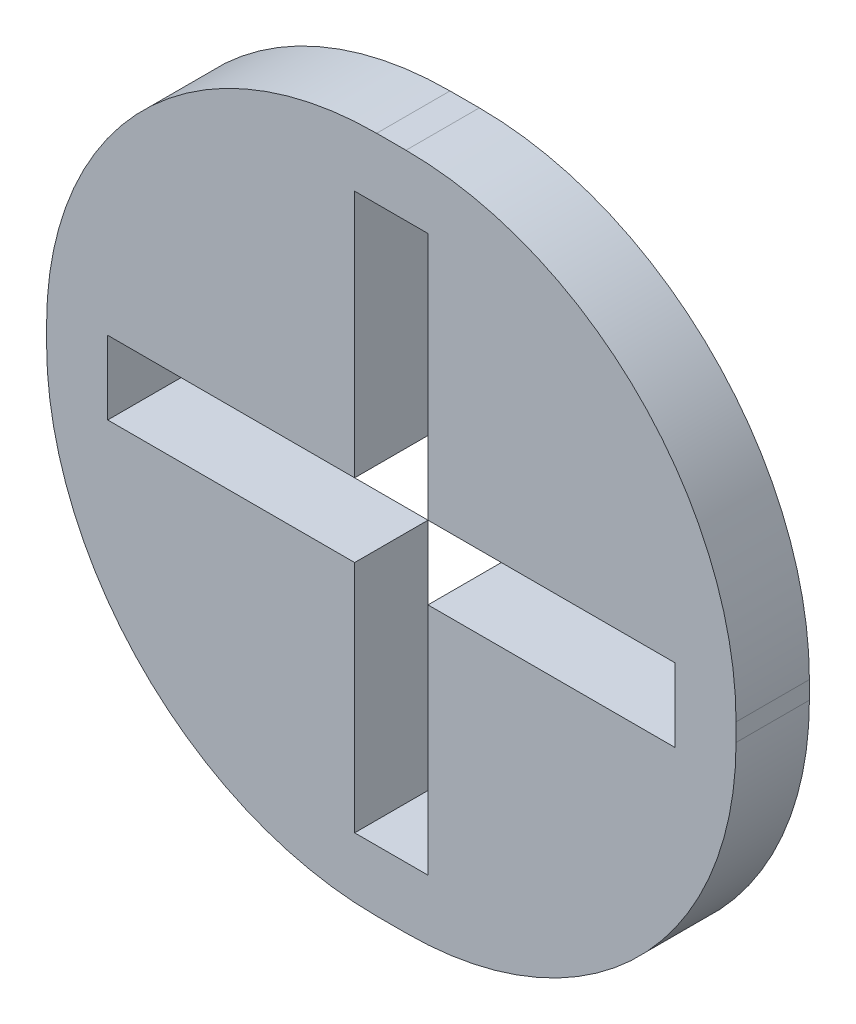
ISO-10303-21;
HEADER;
FILE_DESCRIPTION(('STEP AP214'),'2;1');
FILE_NAME('part.step','',(''),(''),'','','');
FILE_SCHEMA(('AUTOMOTIVE_DESIGN { 1 0 10303 214 1 1 1 1 }'));
ENDSEC;
DATA;
#1=APPLICATION_CONTEXT('core data for automotive mechanical design processes');
#2=APPLICATION_PROTOCOL_DEFINITION('international standard','automotive_design',2000,#1);
#3=PRODUCT_CONTEXT('',#1,'mechanical');
#4=PRODUCT('Part','Part','',(#3));
#5=PRODUCT_RELATED_PRODUCT_CATEGORY('part','',(#4));
#6=PRODUCT_DEFINITION_FORMATION('','',#4);
#7=PRODUCT_DEFINITION_CONTEXT('part definition',#1,'design');
#8=PRODUCT_DEFINITION('design','',#6,#7);
#9=PRODUCT_DEFINITION_SHAPE('','',#8);
#10=(LENGTH_UNIT() NAMED_UNIT(*) SI_UNIT(.MILLI.,.METRE.));
#11=(NAMED_UNIT(*) PLANE_ANGLE_UNIT() SI_UNIT($,.RADIAN.));
#12=(NAMED_UNIT(*) SI_UNIT($,.STERADIAN.) SOLID_ANGLE_UNIT());
#13=UNCERTAINTY_MEASURE_WITH_UNIT(LENGTH_MEASURE(1.E-05),#10,'distance_accuracy_value','');
#14=(GEOMETRIC_REPRESENTATION_CONTEXT(3) GLOBAL_UNCERTAINTY_ASSIGNED_CONTEXT((#13)) GLOBAL_UNIT_ASSIGNED_CONTEXT((#10,
#11,#12)) REPRESENTATION_CONTEXT('',''));
#15=CARTESIAN_POINT('',(0.,0.,0.));
#16=DIRECTION('',(0.,0.,1.));
#17=DIRECTION('',(1.,0.,0.));
#18=AXIS2_PLACEMENT_3D('',#15,#16,#17);
#19=CARTESIAN_POINT('',(0.,13.865,3.));
#20=DIRECTION('',(0.,-1.,0.));
#21=DIRECTION('',(0.,0.,-1.));
#22=AXIS2_PLACEMENT_3D('',#19,#20,#21);
#23=PLANE('',#22);
#24=DIRECTION('',(-1.,0.,0.));
#25=VECTOR('',#24,1.);
#26=CARTESIAN_POINT('',(0.,13.865,0.));
#27=LINE('',#26,#25);
#28=CARTESIAN_POINT('',(0.599999999999993,13.865,0.));
#29=VERTEX_POINT('',#28);
#30=CARTESIAN_POINT('',(-0.60000000000001,13.865,0.));
#31=VERTEX_POINT('',#30);
#32=EDGE_CURVE('E254',#29,#31,#27,.T.);
#33=ORIENTED_EDGE('',*,*,#32,.T.);
#34=DIRECTION('',(0.,0.,-1.));
#35=VECTOR('',#34,1.);
#36=CARTESIAN_POINT('',(-0.60000000000001,13.865,3.));
#37=LINE('',#36,#35);
#38=CARTESIAN_POINT('',(-0.60000000000001,13.865,3.));
#39=VERTEX_POINT('',#38);
#40=EDGE_CURVE('E11',#39,#31,#37,.T.);
#41=ORIENTED_EDGE('',*,*,#40,.F.);
#42=DIRECTION('',(-1.,0.,0.));
#43=VECTOR('',#42,1.);
#44=CARTESIAN_POINT('',(0.,13.865,3.));
#45=LINE('',#44,#43);
#46=CARTESIAN_POINT('',(0.599999999999993,13.865,3.));
#47=VERTEX_POINT('',#46);
#48=EDGE_CURVE('E405',#47,#39,#45,.T.);
#49=ORIENTED_EDGE('',*,*,#48,.F.);
#50=DIRECTION('',(0.,0.,-1.));
#51=VECTOR('',#50,1.);
#52=CARTESIAN_POINT('',(0.599999999999993,13.865,3.));
#53=LINE('',#52,#51);
#54=EDGE_CURVE('E281',#47,#29,#53,.T.);
#55=ORIENTED_EDGE('',*,*,#54,.T.);
#56=EDGE_LOOP('',(#33,#41,#49,#55));
#57=FACE_BOUND('',#56,.T.);
#58=ADVANCED_FACE('F45',(#57),#23,.F.);
#59=CARTESIAN_POINT('',(-0.600000000000008,0.365000000000019,3.));
#60=DIRECTION('',(0.,0.,-1.));
#61=DIRECTION('',(-1.,0.,0.));
#62=AXIS2_PLACEMENT_3D('',#59,#60,#61);
#63=CYLINDRICAL_SURFACE('',#62,13.5);
#64=CARTESIAN_POINT('',(-0.600000000000008,0.365000000000019,0.));
#65=DIRECTION('',(0.,0.,1.));
#66=DIRECTION('',(1.,0.,0.));
#67=AXIS2_PLACEMENT_3D('',#64,#65,#66);
#68=CIRCLE('',#67,13.5);
#69=CARTESIAN_POINT('',(-14.1,0.365000000000011,0.));
#70=VERTEX_POINT('',#69);
#71=EDGE_CURVE('E258',#31,#70,#68,.T.);
#72=ORIENTED_EDGE('',*,*,#71,.T.);
#73=DIRECTION('',(0.,0.,-1.));
#74=VECTOR('',#73,1.);
#75=CARTESIAN_POINT('',(-14.1,0.365000000000011,3.));
#76=LINE('',#75,#74);
#77=CARTESIAN_POINT('',(-14.1,0.365000000000011,3.));
#78=VERTEX_POINT('',#77);
#79=EDGE_CURVE('E56',#78,#70,#76,.T.);
#80=ORIENTED_EDGE('',*,*,#79,.F.);
#81=CARTESIAN_POINT('',(-0.600000000000008,0.365000000000019,3.));
#82=DIRECTION('',(0.,0.,1.));
#83=DIRECTION('',(1.,0.,0.));
#84=AXIS2_PLACEMENT_3D('',#81,#82,#83);
#85=CIRCLE('',#84,13.5);
#86=EDGE_CURVE('E408',#39,#78,#85,.T.);
#87=ORIENTED_EDGE('',*,*,#86,.F.);
#88=ORIENTED_EDGE('',*,*,#40,.T.);
#89=EDGE_LOOP('',(#72,#80,#87,#88));
#90=FACE_BOUND('',#89,.T.);
#91=ADVANCED_FACE('F440',(#90),#63,.T.);
#92=CARTESIAN_POINT('',(-14.1,-1.00518908265503E-13,3.));
#93=DIRECTION('',(-1.,0.,0.));
#94=DIRECTION('',(0.,-1.,0.));
#95=AXIS2_PLACEMENT_3D('',#92,#93,#94);
#96=PLANE('',#95);
#97=DIRECTION('',(0.,1.,0.));
#98=VECTOR('',#97,1.);
#99=CARTESIAN_POINT('',(-14.1,-1.00518908265503E-13,0.));
#100=LINE('',#99,#98);
#101=CARTESIAN_POINT('',(-14.1,-0.365000000000006,0.));
#102=VERTEX_POINT('',#101);
#103=EDGE_CURVE('E262',#102,#70,#100,.T.);
#104=ORIENTED_EDGE('',*,*,#103,.F.);
#105=DIRECTION('',(0.,0.,-1.));
#106=VECTOR('',#105,1.);
#107=CARTESIAN_POINT('',(-14.1,-0.365000000000006,3.));
#108=LINE('',#107,#106);
#109=CARTESIAN_POINT('',(-14.1,-0.365000000000006,3.));
#110=VERTEX_POINT('',#109);
#111=EDGE_CURVE('E291',#110,#102,#108,.T.);
#112=ORIENTED_EDGE('',*,*,#111,.F.);
#113=DIRECTION('',(0.,1.,0.));
#114=VECTOR('',#113,1.);
#115=CARTESIAN_POINT('',(-14.1,-1.00518908265503E-13,3.));
#116=LINE('',#115,#114);
#117=EDGE_CURVE('E411',#110,#78,#116,.T.);
#118=ORIENTED_EDGE('',*,*,#117,.T.);
#119=ORIENTED_EDGE('',*,*,#79,.T.);
#120=EDGE_LOOP('',(#104,#112,#118,#119));
#121=FACE_BOUND('',#120,.T.);
#122=ADVANCED_FACE('F445',(#121),#96,.T.);
#123=CARTESIAN_POINT('',(-0.600000000000008,-0.364999999999998,3.));
#124=DIRECTION('',(0.,0.,-1.));
#125=DIRECTION('',(-1.,0.,0.));
#126=AXIS2_PLACEMENT_3D('',#123,#124,#125);
#127=CYLINDRICAL_SURFACE('',#126,13.5);
#128=CARTESIAN_POINT('',(-0.600000000000008,-0.364999999999998,0.));
#129=DIRECTION('',(0.,0.,1.));
#130=DIRECTION('',(1.,0.,0.));
#131=AXIS2_PLACEMENT_3D('',#128,#129,#130);
#132=CIRCLE('',#131,13.5);
#133=CARTESIAN_POINT('',(-0.600000000000006,-13.865,0.));
#134=VERTEX_POINT('',#133);
#135=EDGE_CURVE('E266',#134,#102,#132,.F.);
#136=ORIENTED_EDGE('',*,*,#135,.F.);
#137=DIRECTION('',(0.,0.,-1.));
#138=VECTOR('',#137,1.);
#139=CARTESIAN_POINT('',(-0.600000000000006,-13.865,3.));
#140=LINE('',#139,#138);
#141=CARTESIAN_POINT('',(-0.600000000000006,-13.865,3.));
#142=VERTEX_POINT('',#141);
#143=EDGE_CURVE('E288',#142,#134,#140,.T.);
#144=ORIENTED_EDGE('',*,*,#143,.F.);
#145=CARTESIAN_POINT('',(-0.600000000000008,-0.364999999999998,3.));
#146=DIRECTION('',(0.,0.,1.));
#147=DIRECTION('',(1.,0.,0.));
#148=AXIS2_PLACEMENT_3D('',#145,#146,#147);
#149=CIRCLE('',#148,13.5);
#150=EDGE_CURVE('E415',#142,#110,#149,.F.);
#151=ORIENTED_EDGE('',*,*,#150,.T.);
#152=ORIENTED_EDGE('',*,*,#111,.T.);
#153=EDGE_LOOP('',(#136,#144,#151,#152));
#154=FACE_BOUND('',#153,.T.);
#155=ADVANCED_FACE('F608',(#154),#127,.T.);
#156=CARTESIAN_POINT('',(0.,-13.865,3.));
#157=DIRECTION('',(0.,-1.,0.));
#158=DIRECTION('',(0.,0.,-1.));
#159=AXIS2_PLACEMENT_3D('',#156,#157,#158);
#160=PLANE('',#159);
#161=DIRECTION('',(-1.,0.,0.));
#162=VECTOR('',#161,1.);
#163=CARTESIAN_POINT('',(0.,-13.865,0.));
#164=LINE('',#163,#162);
#165=CARTESIAN_POINT('',(0.600000000000006,-13.865,0.));
#166=VERTEX_POINT('',#165);
#167=EDGE_CURVE('E270',#166,#134,#164,.T.);
#168=ORIENTED_EDGE('',*,*,#167,.F.);
#169=DIRECTION('',(0.,0.,-1.));
#170=VECTOR('',#169,1.);
#171=CARTESIAN_POINT('',(0.600000000000006,-13.865,3.));
#172=LINE('',#171,#170);
#173=CARTESIAN_POINT('',(0.600000000000006,-13.865,3.));
#174=VERTEX_POINT('',#173);
#175=EDGE_CURVE('E212',#174,#166,#172,.T.);
#176=ORIENTED_EDGE('',*,*,#175,.F.);
#177=DIRECTION('',(-1.,0.,0.));
#178=VECTOR('',#177,1.);
#179=CARTESIAN_POINT('',(0.,-13.865,3.));
#180=LINE('',#179,#178);
#181=EDGE_CURVE('E203',#174,#142,#180,.T.);
#182=ORIENTED_EDGE('',*,*,#181,.T.);
#183=ORIENTED_EDGE('',*,*,#143,.T.);
#184=EDGE_LOOP('',(#168,#176,#182,#183));
#185=FACE_BOUND('',#184,.T.);
#186=ADVANCED_FACE('F421',(#185),#160,.T.);
#187=CARTESIAN_POINT('',(0.6,-0.364999999999997,3.));
#188=DIRECTION('',(0.,0.,-1.));
#189=DIRECTION('',(-1.,0.,0.));
#190=AXIS2_PLACEMENT_3D('',#187,#188,#189);
#191=CYLINDRICAL_SURFACE('',#190,13.5);
#192=CARTESIAN_POINT('',(0.6,-0.364999999999997,0.));
#193=DIRECTION('',(0.,0.,1.));
#194=DIRECTION('',(1.,0.,0.));
#195=AXIS2_PLACEMENT_3D('',#192,#193,#194);
#196=CIRCLE('',#195,13.5);
#197=CARTESIAN_POINT('',(14.1,-0.364999999999997,0.));
#198=VERTEX_POINT('',#197);
#199=EDGE_CURVE('E210',#166,#198,#196,.T.);
#200=ORIENTED_EDGE('',*,*,#199,.T.);
#201=DIRECTION('',(0.,0.,-1.));
#202=VECTOR('',#201,1.);
#203=CARTESIAN_POINT('',(14.1,-0.364999999999997,3.));
#204=LINE('',#203,#202);
#205=CARTESIAN_POINT('',(14.1,-0.364999999999997,3.));
#206=VERTEX_POINT('',#205);
#207=EDGE_CURVE('E207',#206,#198,#204,.T.);
#208=ORIENTED_EDGE('',*,*,#207,.F.);
#209=CARTESIAN_POINT('',(0.6,-0.364999999999997,3.));
#210=DIRECTION('',(0.,0.,1.));
#211=DIRECTION('',(1.,0.,0.));
#212=AXIS2_PLACEMENT_3D('',#209,#210,#211);
#213=CIRCLE('',#212,13.5);
#214=EDGE_CURVE('E196',#174,#206,#213,.T.);
#215=ORIENTED_EDGE('',*,*,#214,.F.);
#216=ORIENTED_EDGE('',*,*,#175,.T.);
#217=EDGE_LOOP('',(#200,#208,#215,#216));
#218=FACE_BOUND('',#217,.T.);
#219=ADVANCED_FACE('F208',(#218),#191,.T.);
#220=CARTESIAN_POINT('',(14.1,0.,3.));
#221=DIRECTION('',(-1.,0.,0.));
#222=DIRECTION('',(0.,-1.,0.));
#223=AXIS2_PLACEMENT_3D('',#220,#221,#222);
#224=PLANE('',#223);
#225=DIRECTION('',(0.,1.,0.));
#226=VECTOR('',#225,1.);
#227=CARTESIAN_POINT('',(14.1,0.,0.));
#228=LINE('',#227,#226);
#229=CARTESIAN_POINT('',(14.1,0.36500000000002,0.));
#230=VERTEX_POINT('',#229);
#231=EDGE_CURVE('E130',#198,#230,#228,.T.);
#232=ORIENTED_EDGE('',*,*,#231,.T.);
#233=DIRECTION('',(0.,0.,-1.));
#234=VECTOR('',#233,1.);
#235=CARTESIAN_POINT('',(14.1,0.36500000000002,3.));
#236=LINE('',#235,#234);
#237=CARTESIAN_POINT('',(14.1,0.36500000000002,3.));
#238=VERTEX_POINT('',#237);
#239=EDGE_CURVE('E213',#238,#230,#236,.T.);
#240=ORIENTED_EDGE('',*,*,#239,.F.);
#241=DIRECTION('',(0.,1.,0.));
#242=VECTOR('',#241,1.);
#243=CARTESIAN_POINT('',(14.1,0.,3.));
#244=LINE('',#243,#242);
#245=EDGE_CURVE('E200',#206,#238,#244,.T.);
#246=ORIENTED_EDGE('',*,*,#245,.F.);
#247=ORIENTED_EDGE('',*,*,#207,.T.);
#248=EDGE_LOOP('',(#232,#240,#246,#247));
#249=FACE_BOUND('',#248,.T.);
#250=ADVANCED_FACE('F215',(#249),#224,.F.);
#251=CARTESIAN_POINT('',(0.,11.365,3.));
#252=DIRECTION('',(0.,1.,0.));
#253=DIRECTION('',(0.,0.,1.));
#254=AXIS2_PLACEMENT_3D('',#251,#252,#253);
#255=PLANE('',#254);
#256=DIRECTION('',(1.,0.,0.));
#257=VECTOR('',#256,1.);
#258=CARTESIAN_POINT('',(0.,11.365,0.));
#259=LINE('',#258,#257);
#260=CARTESIAN_POINT('',(-1.5,11.365,0.));
#261=VERTEX_POINT('',#260);
#262=CARTESIAN_POINT('',(1.5,11.365,0.));
#263=VERTEX_POINT('',#262);
#264=EDGE_CURVE('E223',#261,#263,#259,.T.);
#265=ORIENTED_EDGE('',*,*,#264,.T.);
#266=DIRECTION('',(0.,0.,-1.));
#267=VECTOR('',#266,1.);
#268=CARTESIAN_POINT('',(1.5,11.365,3.));
#269=LINE('',#268,#267);
#270=CARTESIAN_POINT('',(1.5,11.365,3.));
#271=VERTEX_POINT('',#270);
#272=EDGE_CURVE('E49',#271,#263,#269,.T.);
#273=ORIENTED_EDGE('',*,*,#272,.F.);
#274=DIRECTION('',(1.,0.,0.));
#275=VECTOR('',#274,1.);
#276=CARTESIAN_POINT('',(0.,11.365,3.));
#277=LINE('',#276,#275);
#278=CARTESIAN_POINT('',(-1.5,11.365,3.));
#279=VERTEX_POINT('',#278);
#280=EDGE_CURVE('E280',#279,#271,#277,.T.);
#281=ORIENTED_EDGE('',*,*,#280,.F.);
#282=DIRECTION('',(0.,0.,-1.));
#283=VECTOR('',#282,1.);
#284=CARTESIAN_POINT('',(-1.5,11.365,3.));
#285=LINE('',#284,#283);
#286=EDGE_CURVE('E219',#279,#261,#285,.T.);
#287=ORIENTED_EDGE('',*,*,#286,.T.);
#288=EDGE_LOOP('',(#265,#273,#281,#287));
#289=FACE_BOUND('',#288,.T.);
#290=ADVANCED_FACE('F47',(#289),#255,.F.);
#291=CARTESIAN_POINT('',(1.5,0.,3.));
#292=DIRECTION('',(1.,0.,0.));
#293=DIRECTION('',(0.,0.,-1.));
#294=AXIS2_PLACEMENT_3D('',#291,#292,#293);
#295=PLANE('',#294);
#296=DIRECTION('',(0.,-1.,0.));
#297=VECTOR('',#296,1.);
#298=CARTESIAN_POINT('',(1.5,0.,0.));
#299=LINE('',#298,#297);
#300=CARTESIAN_POINT('',(1.5,1.21,0.));
#301=VERTEX_POINT('',#300);
#302=EDGE_CURVE('E227',#263,#301,#299,.T.);
#303=ORIENTED_EDGE('',*,*,#302,.T.);
#304=DIRECTION('',(0.,0.,-1.));
#305=VECTOR('',#304,1.);
#306=CARTESIAN_POINT('',(1.5,1.21,3.));
#307=LINE('',#306,#305);
#308=CARTESIAN_POINT('',(1.5,1.21,3.));
#309=VERTEX_POINT('',#308);
#310=EDGE_CURVE('E329',#309,#301,#307,.T.);
#311=ORIENTED_EDGE('',*,*,#310,.F.);
#312=DIRECTION('',(0.,-1.,0.));
#313=VECTOR('',#312,1.);
#314=CARTESIAN_POINT('',(1.5,0.,3.));
#315=LINE('',#314,#313);
#316=EDGE_CURVE('E145',#271,#309,#315,.T.);
#317=ORIENTED_EDGE('',*,*,#316,.F.);
#318=ORIENTED_EDGE('',*,*,#272,.T.);
#319=EDGE_LOOP('',(#303,#311,#317,#318));
#320=FACE_BOUND('',#319,.T.);
#321=ADVANCED_FACE('F337',(#320),#295,.F.);
#322=CARTESIAN_POINT('',(0.,1.21,3.));
#323=DIRECTION('',(0.,1.,0.));
#324=DIRECTION('',(0.,0.,1.));
#325=AXIS2_PLACEMENT_3D('',#322,#323,#324);
#326=PLANE('',#325);
#327=DIRECTION('',(1.,0.,0.));
#328=VECTOR('',#327,1.);
#329=CARTESIAN_POINT('',(0.,1.21,0.));
#330=LINE('',#329,#328);
#331=CARTESIAN_POINT('',(11.6,1.21,0.));
#332=VERTEX_POINT('',#331);
#333=EDGE_CURVE('E230',#301,#332,#330,.T.);
#334=ORIENTED_EDGE('',*,*,#333,.T.);
#335=DIRECTION('',(0.,0.,-1.));
#336=VECTOR('',#335,1.);
#337=CARTESIAN_POINT('',(11.6,1.21,3.));
#338=LINE('',#337,#336);
#339=CARTESIAN_POINT('',(11.6,1.21,3.));
#340=VERTEX_POINT('',#339);
#341=EDGE_CURVE('E326',#340,#332,#338,.T.);
#342=ORIENTED_EDGE('',*,*,#341,.F.);
#343=DIRECTION('',(1.,0.,0.));
#344=VECTOR('',#343,1.);
#345=CARTESIAN_POINT('',(0.,1.21,3.));
#346=LINE('',#345,#344);
#347=EDGE_CURVE('E477',#309,#340,#346,.T.);
#348=ORIENTED_EDGE('',*,*,#347,.F.);
#349=ORIENTED_EDGE('',*,*,#310,.T.);
#350=EDGE_LOOP('',(#334,#342,#348,#349));
#351=FACE_BOUND('',#350,.T.);
#352=ADVANCED_FACE('F452',(#351),#326,.F.);
#353=CARTESIAN_POINT('',(11.6,0.,3.));
#354=DIRECTION('',(1.,0.,0.));
#355=DIRECTION('',(0.,0.,-1.));
#356=AXIS2_PLACEMENT_3D('',#353,#354,#355);
#357=PLANE('',#356);
#358=DIRECTION('',(0.,-1.,0.));
#359=VECTOR('',#358,1.);
#360=CARTESIAN_POINT('',(11.6,0.,0.));
#361=LINE('',#360,#359);
#362=CARTESIAN_POINT('',(11.6,-1.79,0.));
#363=VERTEX_POINT('',#362);
#364=EDGE_CURVE('E234',#332,#363,#361,.T.);
#365=ORIENTED_EDGE('',*,*,#364,.T.);
#366=DIRECTION('',(0.,0.,-1.));
#367=VECTOR('',#366,1.);
#368=CARTESIAN_POINT('',(11.6,-1.79,3.));
#369=LINE('',#368,#367);
#370=CARTESIAN_POINT('',(11.6,-1.79,3.));
#371=VERTEX_POINT('',#370);
#372=EDGE_CURVE('E322',#371,#363,#369,.T.);
#373=ORIENTED_EDGE('',*,*,#372,.F.);
#374=DIRECTION('',(0.,-1.,0.));
#375=VECTOR('',#374,1.);
#376=CARTESIAN_POINT('',(11.6,0.,3.));
#377=LINE('',#376,#375);
#378=EDGE_CURVE('E475',#340,#371,#377,.T.);
#379=ORIENTED_EDGE('',*,*,#378,.F.);
#380=ORIENTED_EDGE('',*,*,#341,.T.);
#381=EDGE_LOOP('',(#365,#373,#379,#380));
#382=FACE_BOUND('',#381,.T.);
#383=ADVANCED_FACE('F461',(#382),#357,.F.);
#384=CARTESIAN_POINT('',(0.,-1.79,3.));
#385=DIRECTION('',(0.,-1.,0.));
#386=DIRECTION('',(0.,0.,-1.));
#387=AXIS2_PLACEMENT_3D('',#384,#385,#386);
#388=PLANE('',#387);
#389=DIRECTION('',(-1.,0.,0.));
#390=VECTOR('',#389,1.);
#391=CARTESIAN_POINT('',(0.,-1.79,0.));
#392=LINE('',#391,#390);
#393=CARTESIAN_POINT('',(1.5,-1.79,0.));
#394=VERTEX_POINT('',#393);
#395=EDGE_CURVE('E238',#363,#394,#392,.T.);
#396=ORIENTED_EDGE('',*,*,#395,.T.);
#397=DIRECTION('',(0.,0.,-1.));
#398=VECTOR('',#397,1.);
#399=CARTESIAN_POINT('',(1.5,-1.79,3.));
#400=LINE('',#399,#398);
#401=CARTESIAN_POINT('',(1.5,-1.79,3.));
#402=VERTEX_POINT('',#401);
#403=EDGE_CURVE('E318',#402,#394,#400,.T.);
#404=ORIENTED_EDGE('',*,*,#403,.F.);
#405=DIRECTION('',(-1.,0.,0.));
#406=VECTOR('',#405,1.);
#407=CARTESIAN_POINT('',(0.,-1.79,3.));
#408=LINE('',#407,#406);
#409=EDGE_CURVE('E397',#371,#402,#408,.T.);
#410=ORIENTED_EDGE('',*,*,#409,.F.);
#411=ORIENTED_EDGE('',*,*,#372,.T.);
#412=EDGE_LOOP('',(#396,#404,#410,#411));
#413=FACE_BOUND('',#412,.T.);
#414=ADVANCED_FACE('F457',(#413),#388,.F.);
#415=CARTESIAN_POINT('',(1.5,-11.365,0.));
#416=VERTEX_POINT('',#415);
#417=EDGE_CURVE('E231',#394,#416,#299,.T.);
#418=ORIENTED_EDGE('',*,*,#417,.T.);
#419=DIRECTION('',(0.,0.,-1.));
#420=VECTOR('',#419,1.);
#421=CARTESIAN_POINT('',(1.5,-11.365,3.));
#422=LINE('',#421,#420);
#423=CARTESIAN_POINT('',(1.5,-11.365,3.));
#424=VERTEX_POINT('',#423);
#425=EDGE_CURVE('E315',#424,#416,#422,.T.);
#426=ORIENTED_EDGE('',*,*,#425,.F.);
#427=EDGE_CURVE('E391',#402,#424,#315,.T.);
#428=ORIENTED_EDGE('',*,*,#427,.F.);
#429=ORIENTED_EDGE('',*,*,#403,.T.);
#430=EDGE_LOOP('',(#418,#426,#428,#429));
#431=FACE_BOUND('',#430,.T.);
#432=ADVANCED_FACE('F377',(#431),#295,.F.);
#433=CARTESIAN_POINT('',(0.,-11.365,3.));
#434=DIRECTION('',(0.,1.,0.));
#435=DIRECTION('',(0.,0.,1.));
#436=AXIS2_PLACEMENT_3D('',#433,#434,#435);
#437=PLANE('',#436);
#438=DIRECTION('',(1.,0.,0.));
#439=VECTOR('',#438,1.);
#440=CARTESIAN_POINT('',(0.,-11.365,0.));
#441=LINE('',#440,#439);
#442=CARTESIAN_POINT('',(-1.5,-11.365,0.));
#443=VERTEX_POINT('',#442);
#444=EDGE_CURVE('E242',#443,#416,#441,.T.);
#445=ORIENTED_EDGE('',*,*,#444,.F.);
#446=DIRECTION('',(0.,0.,-1.));
#447=VECTOR('',#446,1.);
#448=CARTESIAN_POINT('',(-1.5,-11.365,3.));
#449=LINE('',#448,#447);
#450=CARTESIAN_POINT('',(-1.5,-11.365,3.));
#451=VERTEX_POINT('',#450);
#452=EDGE_CURVE('E312',#451,#443,#449,.T.);
#453=ORIENTED_EDGE('',*,*,#452,.F.);
#454=DIRECTION('',(1.,0.,0.));
#455=VECTOR('',#454,1.);
#456=CARTESIAN_POINT('',(0.,-11.365,3.));
#457=LINE('',#456,#455);
#458=EDGE_CURVE('E386',#451,#424,#457,.T.);
#459=ORIENTED_EDGE('',*,*,#458,.T.);
#460=ORIENTED_EDGE('',*,*,#425,.T.);
#461=EDGE_LOOP('',(#445,#453,#459,#460));
#462=FACE_BOUND('',#461,.T.);
#463=ADVANCED_FACE('F384',(#462),#437,.T.);
#464=CARTESIAN_POINT('',(-1.5,0.,3.));
#465=DIRECTION('',(1.,0.,0.));
#466=DIRECTION('',(0.,0.,-1.));
#467=AXIS2_PLACEMENT_3D('',#464,#465,#466);
#468=PLANE('',#467);
#469=DIRECTION('',(0.,-1.,0.));
#470=VECTOR('',#469,1.);
#471=CARTESIAN_POINT('',(-1.5,0.,0.));
#472=LINE('',#471,#470);
#473=CARTESIAN_POINT('',(-1.5,-1.79,0.));
#474=VERTEX_POINT('',#473);
#475=EDGE_CURVE('E246',#474,#443,#472,.T.);
#476=ORIENTED_EDGE('',*,*,#475,.F.);
#477=DIRECTION('',(0.,0.,-1.));
#478=VECTOR('',#477,1.);
#479=CARTESIAN_POINT('',(-1.5,-1.79,3.));
#480=LINE('',#479,#478);
#481=CARTESIAN_POINT('',(-1.5,-1.79,3.));
#482=VERTEX_POINT('',#481);
#483=EDGE_CURVE('E309',#482,#474,#480,.T.);
#484=ORIENTED_EDGE('',*,*,#483,.F.);
#485=DIRECTION('',(0.,-1.,0.));
#486=VECTOR('',#485,1.);
#487=CARTESIAN_POINT('',(-1.5,0.,3.));
#488=LINE('',#487,#486);
#489=EDGE_CURVE('E390',#482,#451,#488,.T.);
#490=ORIENTED_EDGE('',*,*,#489,.T.);
#491=ORIENTED_EDGE('',*,*,#452,.T.);
#492=EDGE_LOOP('',(#476,#484,#490,#491));
#493=FACE_BOUND('',#492,.T.);
#494=ADVANCED_FACE('F436',(#493),#468,.T.);
#495=CARTESIAN_POINT('',(-11.6,-1.79,0.));
#496=VERTEX_POINT('',#495);
#497=EDGE_CURVE('E241',#474,#496,#392,.T.);
#498=ORIENTED_EDGE('',*,*,#497,.T.);
#499=DIRECTION('',(0.,0.,-1.));
#500=VECTOR('',#499,1.);
#501=CARTESIAN_POINT('',(-11.6,-1.79,3.));
#502=LINE('',#501,#500);
#503=CARTESIAN_POINT('',(-11.6,-1.79,3.));
#504=VERTEX_POINT('',#503);
#505=EDGE_CURVE('E305',#504,#496,#502,.T.);
#506=ORIENTED_EDGE('',*,*,#505,.F.);
#507=EDGE_CURVE('E369',#482,#504,#408,.T.);
#508=ORIENTED_EDGE('',*,*,#507,.F.);
#509=ORIENTED_EDGE('',*,*,#483,.T.);
#510=EDGE_LOOP('',(#498,#506,#508,#509));
#511=FACE_BOUND('',#510,.T.);
#512=ADVANCED_FACE('F368',(#511),#388,.F.);
#513=CARTESIAN_POINT('',(-11.6,0.,3.));
#514=DIRECTION('',(-1.,0.,0.));
#515=DIRECTION('',(0.,0.,1.));
#516=AXIS2_PLACEMENT_3D('',#513,#514,#515);
#517=PLANE('',#516);
#518=DIRECTION('',(0.,1.,0.));
#519=VECTOR('',#518,1.);
#520=CARTESIAN_POINT('',(-11.6,0.,0.));
#521=LINE('',#520,#519);
#522=CARTESIAN_POINT('',(-11.6,1.21,0.));
#523=VERTEX_POINT('',#522);
#524=EDGE_CURVE('E251',#496,#523,#521,.T.);
#525=ORIENTED_EDGE('',*,*,#524,.T.);
#526=DIRECTION('',(0.,0.,-1.));
#527=VECTOR('',#526,1.);
#528=CARTESIAN_POINT('',(-11.6,1.21,3.));
#529=LINE('',#528,#527);
#530=CARTESIAN_POINT('',(-11.6,1.21,3.));
#531=VERTEX_POINT('',#530);
#532=EDGE_CURVE('E301',#531,#523,#529,.T.);
#533=ORIENTED_EDGE('',*,*,#532,.F.);
#534=DIRECTION('',(0.,1.,0.));
#535=VECTOR('',#534,1.);
#536=CARTESIAN_POINT('',(-11.6,0.,3.));
#537=LINE('',#536,#535);
#538=EDGE_CURVE('E365',#504,#531,#537,.T.);
#539=ORIENTED_EDGE('',*,*,#538,.F.);
#540=ORIENTED_EDGE('',*,*,#505,.T.);
#541=EDGE_LOOP('',(#525,#533,#539,#540));
#542=FACE_BOUND('',#541,.T.);
#543=ADVANCED_FACE('F362',(#542),#517,.F.);
#544=CARTESIAN_POINT('',(-1.5,1.21,0.));
#545=VERTEX_POINT('',#544);
#546=EDGE_CURVE('E235',#523,#545,#330,.T.);
#547=ORIENTED_EDGE('',*,*,#546,.T.);
#548=DIRECTION('',(0.,0.,-1.));
#549=VECTOR('',#548,1.);
#550=CARTESIAN_POINT('',(-1.5,1.21,3.));
#551=LINE('',#550,#549);
#552=CARTESIAN_POINT('',(-1.5,1.21,3.));
#553=VERTEX_POINT('',#552);
#554=EDGE_CURVE('E298',#553,#545,#551,.T.);
#555=ORIENTED_EDGE('',*,*,#554,.F.);
#556=EDGE_CURVE('E404',#531,#553,#346,.T.);
#557=ORIENTED_EDGE('',*,*,#556,.F.);
#558=ORIENTED_EDGE('',*,*,#532,.T.);
#559=EDGE_LOOP('',(#547,#555,#557,#558));
#560=FACE_BOUND('',#559,.T.);
#561=ADVANCED_FACE('F355',(#560),#326,.F.);
#562=EDGE_CURVE('E250',#261,#545,#472,.T.);
#563=ORIENTED_EDGE('',*,*,#562,.F.);
#564=ORIENTED_EDGE('',*,*,#286,.F.);
#565=EDGE_CURVE('E396',#279,#553,#488,.T.);
#566=ORIENTED_EDGE('',*,*,#565,.T.);
#567=ORIENTED_EDGE('',*,*,#554,.T.);
#568=EDGE_LOOP('',(#563,#564,#566,#567));
#569=FACE_BOUND('',#568,.T.);
#570=ADVANCED_FACE('F348',(#569),#468,.T.);
#571=CARTESIAN_POINT('',(0.6,0.36500000000002,3.));
#572=DIRECTION('',(0.,0.,-1.));
#573=DIRECTION('',(-1.,0.,0.));
#574=AXIS2_PLACEMENT_3D('',#571,#572,#573);
#575=CYLINDRICAL_SURFACE('',#574,13.5);
#576=CARTESIAN_POINT('',(0.6,0.36500000000002,0.));
#577=DIRECTION('',(0.,0.,1.));
#578=DIRECTION('',(1.,0.,0.));
#579=AXIS2_PLACEMENT_3D('',#576,#577,#578);
#580=CIRCLE('',#579,13.5);
#581=EDGE_CURVE('E136',#230,#29,#580,.T.);
#582=ORIENTED_EDGE('',*,*,#581,.T.);
#583=ORIENTED_EDGE('',*,*,#54,.F.);
#584=CARTESIAN_POINT('',(0.6,0.36500000000002,3.));
#585=DIRECTION('',(0.,0.,1.));
#586=DIRECTION('',(1.,0.,0.));
#587=AXIS2_PLACEMENT_3D('',#584,#585,#586);
#588=CIRCLE('',#587,13.5);
#589=EDGE_CURVE('E65',#238,#47,#588,.T.);
#590=ORIENTED_EDGE('',*,*,#589,.F.);
#591=ORIENTED_EDGE('',*,*,#239,.T.);
#592=EDGE_LOOP('',(#582,#583,#590,#591));
#593=FACE_BOUND('',#592,.T.);
#594=ADVANCED_FACE('F427',(#593),#575,.T.);
#595=CARTESIAN_POINT('',(0.,0.,3.));
#596=DIRECTION('',(0.,0.,1.));
#597=DIRECTION('',(1.,0.,0.));
#598=AXIS2_PLACEMENT_3D('',#595,#596,#597);
#599=PLANE('',#598);
#600=ORIENTED_EDGE('',*,*,#280,.T.);
#601=ORIENTED_EDGE('',*,*,#316,.T.);
#602=ORIENTED_EDGE('',*,*,#347,.T.);
#603=ORIENTED_EDGE('',*,*,#378,.T.);
#604=ORIENTED_EDGE('',*,*,#409,.T.);
#605=ORIENTED_EDGE('',*,*,#427,.T.);
#606=ORIENTED_EDGE('',*,*,#458,.F.);
#607=ORIENTED_EDGE('',*,*,#489,.F.);
#608=ORIENTED_EDGE('',*,*,#507,.T.);
#609=ORIENTED_EDGE('',*,*,#538,.T.);
#610=ORIENTED_EDGE('',*,*,#556,.T.);
#611=ORIENTED_EDGE('',*,*,#565,.F.);
#612=EDGE_LOOP('',(#600,#601,#602,#603,#604,#605,#606,#607,#608,#609,#610,#611));
#613=FACE_BOUND('',#612,.T.);
#614=ORIENTED_EDGE('',*,*,#48,.T.);
#615=ORIENTED_EDGE('',*,*,#86,.T.);
#616=ORIENTED_EDGE('',*,*,#117,.F.);
#617=ORIENTED_EDGE('',*,*,#150,.F.);
#618=ORIENTED_EDGE('',*,*,#181,.F.);
#619=ORIENTED_EDGE('',*,*,#214,.T.);
#620=ORIENTED_EDGE('',*,*,#245,.T.);
#621=ORIENTED_EDGE('',*,*,#589,.T.);
#622=EDGE_LOOP('',(#614,#615,#616,#617,#618,#619,#620,#621));
#623=FACE_BOUND('',#622,.T.);
#624=ADVANCED_FACE('F198',(#613,#623),#599,.T.);
#625=CARTESIAN_POINT('',(0.,0.,0.));
#626=DIRECTION('',(0.,0.,1.));
#627=DIRECTION('',(1.,0.,0.));
#628=AXIS2_PLACEMENT_3D('',#625,#626,#627);
#629=PLANE('',#628);
#630=ORIENTED_EDGE('',*,*,#264,.F.);
#631=ORIENTED_EDGE('',*,*,#562,.T.);
#632=ORIENTED_EDGE('',*,*,#546,.F.);
#633=ORIENTED_EDGE('',*,*,#524,.F.);
#634=ORIENTED_EDGE('',*,*,#497,.F.);
#635=ORIENTED_EDGE('',*,*,#475,.T.);
#636=ORIENTED_EDGE('',*,*,#444,.T.);
#637=ORIENTED_EDGE('',*,*,#417,.F.);
#638=ORIENTED_EDGE('',*,*,#395,.F.);
#639=ORIENTED_EDGE('',*,*,#364,.F.);
#640=ORIENTED_EDGE('',*,*,#333,.F.);
#641=ORIENTED_EDGE('',*,*,#302,.F.);
#642=EDGE_LOOP('',(#630,#631,#632,#633,#634,#635,#636,#637,#638,#639,#640,#641));
#643=FACE_BOUND('',#642,.T.);
#644=ORIENTED_EDGE('',*,*,#32,.F.);
#645=ORIENTED_EDGE('',*,*,#581,.F.);
#646=ORIENTED_EDGE('',*,*,#231,.F.);
#647=ORIENTED_EDGE('',*,*,#199,.F.);
#648=ORIENTED_EDGE('',*,*,#167,.T.);
#649=ORIENTED_EDGE('',*,*,#135,.T.);
#650=ORIENTED_EDGE('',*,*,#103,.T.);
#651=ORIENTED_EDGE('',*,*,#71,.F.);
#652=EDGE_LOOP('',(#644,#645,#646,#647,#648,#649,#650,#651));
#653=FACE_BOUND('',#652,.T.);
#654=ADVANCED_FACE('F344',(#643,#653),#629,.F.);
#655=CLOSED_SHELL('',(#58,#91,#122,#155,#186,#219,#250,#290,#321,#352,#383,#414,#432,#463,#494,
#512,#543,#561,#570,#594,#624,#654));
#656=MANIFOLD_SOLID_BREP('B2',#655);
#657=ADVANCED_BREP_SHAPE_REPRESENTATION('',(#18,#656),#14);
#658=SHAPE_DEFINITION_REPRESENTATION(#9,#657);
ENDSEC;
END-ISO-10303-21;
